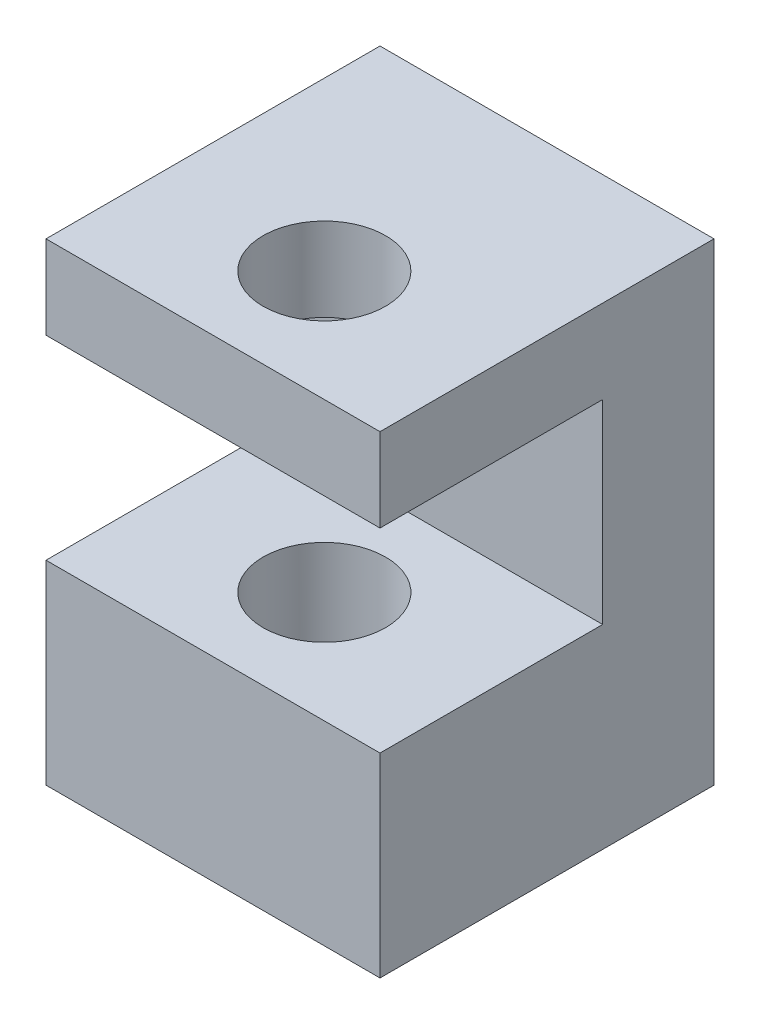
ISO-10303-21;
HEADER;
FILE_DESCRIPTION(('STEP AP214'),'2;1');
FILE_NAME('part.step','',(''),(''),'','','');
FILE_SCHEMA(('AUTOMOTIVE_DESIGN { 1 0 10303 214 1 1 1 1 }'));
ENDSEC;
DATA;
#1=APPLICATION_CONTEXT('core data for automotive mechanical design processes');
#2=APPLICATION_PROTOCOL_DEFINITION('international standard','automotive_design',2000,#1);
#3=PRODUCT_CONTEXT('',#1,'mechanical');
#4=PRODUCT('Part','Part','',(#3));
#5=PRODUCT_RELATED_PRODUCT_CATEGORY('part','',(#4));
#6=PRODUCT_DEFINITION_FORMATION('','',#4);
#7=PRODUCT_DEFINITION_CONTEXT('part definition',#1,'design');
#8=PRODUCT_DEFINITION('design','',#6,#7);
#9=PRODUCT_DEFINITION_SHAPE('','',#8);
#10=(LENGTH_UNIT() NAMED_UNIT(*) SI_UNIT(.MILLI.,.METRE.));
#11=(NAMED_UNIT(*) PLANE_ANGLE_UNIT() SI_UNIT($,.RADIAN.));
#12=(NAMED_UNIT(*) SI_UNIT($,.STERADIAN.) SOLID_ANGLE_UNIT());
#13=UNCERTAINTY_MEASURE_WITH_UNIT(LENGTH_MEASURE(1.E-05),#10,'distance_accuracy_value','');
#14=(GEOMETRIC_REPRESENTATION_CONTEXT(3) GLOBAL_UNCERTAINTY_ASSIGNED_CONTEXT((#13)) GLOBAL_UNIT_ASSIGNED_CONTEXT((#10,
#11,#12)) REPRESENTATION_CONTEXT('',''));
#15=CARTESIAN_POINT('',(0.,0.,0.));
#16=DIRECTION('',(0.,0.,1.));
#17=DIRECTION('',(1.,0.,0.));
#18=AXIS2_PLACEMENT_3D('',#15,#16,#17);
#19=CARTESIAN_POINT('',(0.,85.,0.));
#20=DIRECTION('',(0.,0.,-1.));
#21=DIRECTION('',(-1.,0.,0.));
#22=AXIS2_PLACEMENT_3D('',#19,#20,#21);
#23=PLANE('',#22);
#24=DIRECTION('',(0.,-1.,0.));
#25=VECTOR('',#24,1.);
#26=CARTESIAN_POINT('',(0.,85.,0.));
#27=LINE('',#26,#25);
#28=CARTESIAN_POINT('',(0.,85.,0.));
#29=VERTEX_POINT('',#28);
#30=CARTESIAN_POINT('',(0.,70.,0.));
#31=VERTEX_POINT('',#30);
#32=EDGE_CURVE('E11',#29,#31,#27,.T.);
#33=ORIENTED_EDGE('',*,*,#32,.T.);
#34=DIRECTION('',(1.,0.,0.));
#35=VECTOR('',#34,1.);
#36=CARTESIAN_POINT('',(0.,70.,0.));
#37=LINE('',#36,#35);
#38=CARTESIAN_POINT('',(60.,70.,0.));
#39=VERTEX_POINT('',#38);
#40=EDGE_CURVE('E160',#31,#39,#37,.T.);
#41=ORIENTED_EDGE('',*,*,#40,.T.);
#42=DIRECTION('',(0.,-1.,0.));
#43=VECTOR('',#42,1.);
#44=CARTESIAN_POINT('',(60.,85.,0.));
#45=LINE('',#44,#43);
#46=CARTESIAN_POINT('',(60.,85.,0.));
#47=VERTEX_POINT('',#46);
#48=EDGE_CURVE('E138',#47,#39,#45,.T.);
#49=ORIENTED_EDGE('',*,*,#48,.F.);
#50=DIRECTION('',(1.,0.,0.));
#51=VECTOR('',#50,1.);
#52=CARTESIAN_POINT('',(0.,85.,0.));
#53=LINE('',#52,#51);
#54=EDGE_CURVE('E93',#29,#47,#53,.T.);
#55=ORIENTED_EDGE('',*,*,#54,.F.);
#56=EDGE_LOOP('',(#33,#41,#49,#55));
#57=FACE_BOUND('',#56,.T.);
#58=ADVANCED_FACE('F39',(#57),#23,.F.);
#59=CARTESIAN_POINT('',(0.,85.,0.));
#60=DIRECTION('',(1.,0.,0.));
#61=DIRECTION('',(0.,0.,-1.));
#62=AXIS2_PLACEMENT_3D('',#59,#60,#61);
#63=PLANE('',#62);
#64=DIRECTION('',(0.,1.,0.));
#65=VECTOR('',#64,1.);
#66=CARTESIAN_POINT('',(0.,70.,-40.));
#67=LINE('',#66,#65);
#68=CARTESIAN_POINT('',(0.,35.,-40.));
#69=VERTEX_POINT('',#68);
#70=CARTESIAN_POINT('',(0.,70.,-40.));
#71=VERTEX_POINT('',#70);
#72=EDGE_CURVE('E122',#69,#71,#67,.T.);
#73=ORIENTED_EDGE('',*,*,#72,.T.);
#74=DIRECTION('',(0.,0.,1.));
#75=VECTOR('',#74,1.);
#76=CARTESIAN_POINT('',(0.,70.,0.));
#77=LINE('',#76,#75);
#78=EDGE_CURVE('E132',#71,#31,#77,.T.);
#79=ORIENTED_EDGE('',*,*,#78,.T.);
#80=ORIENTED_EDGE('',*,*,#32,.F.);
#81=DIRECTION('',(0.,0.,1.));
#82=VECTOR('',#81,1.);
#83=CARTESIAN_POINT('',(0.,85.,0.));
#84=LINE('',#83,#82);
#85=CARTESIAN_POINT('',(0.,85.,-60.));
#86=VERTEX_POINT('',#85);
#87=EDGE_CURVE('E151',#86,#29,#84,.T.);
#88=ORIENTED_EDGE('',*,*,#87,.F.);
#89=DIRECTION('',(0.,-1.,0.));
#90=VECTOR('',#89,1.);
#91=CARTESIAN_POINT('',(0.,85.,-60.));
#92=LINE('',#91,#90);
#93=CARTESIAN_POINT('',(0.,0.,-60.));
#94=VERTEX_POINT('',#93);
#95=EDGE_CURVE('E146',#86,#94,#92,.T.);
#96=ORIENTED_EDGE('',*,*,#95,.T.);
#97=DIRECTION('',(0.,0.,1.));
#98=VECTOR('',#97,1.);
#99=CARTESIAN_POINT('',(0.,0.,0.));
#100=LINE('',#99,#98);
#101=CARTESIAN_POINT('',(0.,0.,0.));
#102=VERTEX_POINT('',#101);
#103=EDGE_CURVE('E136',#94,#102,#100,.T.);
#104=ORIENTED_EDGE('',*,*,#103,.T.);
#105=CARTESIAN_POINT('',(0.,35.,0.));
#106=VERTEX_POINT('',#105);
#107=EDGE_CURVE('E49',#106,#102,#27,.T.);
#108=ORIENTED_EDGE('',*,*,#107,.F.);
#109=DIRECTION('',(0.,0.,-1.));
#110=VECTOR('',#109,1.);
#111=CARTESIAN_POINT('',(0.,35.,0.));
#112=LINE('',#111,#110);
#113=EDGE_CURVE('E114',#106,#69,#112,.T.);
#114=ORIENTED_EDGE('',*,*,#113,.T.);
#115=EDGE_LOOP('',(#73,#79,#80,#88,#96,#104,#108,#114));
#116=FACE_BOUND('',#115,.T.);
#117=ADVANCED_FACE('F41',(#116),#63,.F.);
#118=CARTESIAN_POINT('',(60.,35.,0.));
#119=VERTEX_POINT('',#118);
#120=CARTESIAN_POINT('',(60.,0.,0.));
#121=VERTEX_POINT('',#120);
#122=EDGE_CURVE('E130',#119,#121,#45,.T.);
#123=ORIENTED_EDGE('',*,*,#122,.F.);
#124=DIRECTION('',(1.,0.,0.));
#125=VECTOR('',#124,1.);
#126=CARTESIAN_POINT('',(0.,35.,0.));
#127=LINE('',#126,#125);
#128=EDGE_CURVE('E56',#106,#119,#127,.T.);
#129=ORIENTED_EDGE('',*,*,#128,.F.);
#130=ORIENTED_EDGE('',*,*,#107,.T.);
#131=DIRECTION('',(1.,0.,0.));
#132=VECTOR('',#131,1.);
#133=CARTESIAN_POINT('',(0.,0.,0.));
#134=LINE('',#133,#132);
#135=EDGE_CURVE('E155',#102,#121,#134,.T.);
#136=ORIENTED_EDGE('',*,*,#135,.T.);
#137=EDGE_LOOP('',(#123,#129,#130,#136));
#138=FACE_BOUND('',#137,.T.);
#139=ADVANCED_FACE('F127',(#138),#23,.F.);
#140=CARTESIAN_POINT('',(60.,85.,0.));
#141=DIRECTION('',(-1.,0.,0.));
#142=DIRECTION('',(0.,0.,1.));
#143=AXIS2_PLACEMENT_3D('',#140,#141,#142);
#144=PLANE('',#143);
#145=ORIENTED_EDGE('',*,*,#48,.T.);
#146=DIRECTION('',(0.,0.,1.));
#147=VECTOR('',#146,1.);
#148=CARTESIAN_POINT('',(60.,70.,0.));
#149=LINE('',#148,#147);
#150=CARTESIAN_POINT('',(60.,70.,-40.));
#151=VERTEX_POINT('',#150);
#152=EDGE_CURVE('E123',#151,#39,#149,.T.);
#153=ORIENTED_EDGE('',*,*,#152,.F.);
#154=DIRECTION('',(0.,1.,0.));
#155=VECTOR('',#154,1.);
#156=CARTESIAN_POINT('',(60.,70.,-40.));
#157=LINE('',#156,#155);
#158=CARTESIAN_POINT('',(60.,35.,-40.));
#159=VERTEX_POINT('',#158);
#160=EDGE_CURVE('E180',#159,#151,#157,.T.);
#161=ORIENTED_EDGE('',*,*,#160,.F.);
#162=DIRECTION('',(0.,0.,-1.));
#163=VECTOR('',#162,1.);
#164=CARTESIAN_POINT('',(60.,35.,0.));
#165=LINE('',#164,#163);
#166=EDGE_CURVE('E184',#119,#159,#165,.T.);
#167=ORIENTED_EDGE('',*,*,#166,.F.);
#168=ORIENTED_EDGE('',*,*,#122,.T.);
#169=DIRECTION('',(0.,0.,-1.));
#170=VECTOR('',#169,1.);
#171=CARTESIAN_POINT('',(60.,0.,0.));
#172=LINE('',#171,#170);
#173=CARTESIAN_POINT('',(60.,0.,-60.));
#174=VERTEX_POINT('',#173);
#175=EDGE_CURVE('E152',#121,#174,#172,.T.);
#176=ORIENTED_EDGE('',*,*,#175,.T.);
#177=DIRECTION('',(0.,-1.,0.));
#178=VECTOR('',#177,1.);
#179=CARTESIAN_POINT('',(60.,85.,-60.));
#180=LINE('',#179,#178);
#181=CARTESIAN_POINT('',(60.,85.,-60.));
#182=VERTEX_POINT('',#181);
#183=EDGE_CURVE('E143',#182,#174,#180,.T.);
#184=ORIENTED_EDGE('',*,*,#183,.F.);
#185=DIRECTION('',(0.,0.,-1.));
#186=VECTOR('',#185,1.);
#187=CARTESIAN_POINT('',(60.,85.,0.));
#188=LINE('',#187,#186);
#189=EDGE_CURVE('E163',#47,#182,#188,.T.);
#190=ORIENTED_EDGE('',*,*,#189,.F.);
#191=EDGE_LOOP('',(#145,#153,#161,#167,#168,#176,#184,#190));
#192=FACE_BOUND('',#191,.T.);
#193=ADVANCED_FACE('F220',(#192),#144,.F.);
#194=CARTESIAN_POINT('',(0.,85.,-60.));
#195=DIRECTION('',(0.,0.,1.));
#196=DIRECTION('',(1.,0.,0.));
#197=AXIS2_PLACEMENT_3D('',#194,#195,#196);
#198=PLANE('',#197);
#199=DIRECTION('',(-1.,0.,0.));
#200=VECTOR('',#199,1.);
#201=CARTESIAN_POINT('',(0.,0.,-60.));
#202=LINE('',#201,#200);
#203=EDGE_CURVE('E86',#174,#94,#202,.T.);
#204=ORIENTED_EDGE('',*,*,#203,.T.);
#205=ORIENTED_EDGE('',*,*,#95,.F.);
#206=DIRECTION('',(-1.,0.,0.));
#207=VECTOR('',#206,1.);
#208=CARTESIAN_POINT('',(0.,85.,-60.));
#209=LINE('',#208,#207);
#210=EDGE_CURVE('E65',#182,#86,#209,.T.);
#211=ORIENTED_EDGE('',*,*,#210,.F.);
#212=ORIENTED_EDGE('',*,*,#183,.T.);
#213=EDGE_LOOP('',(#204,#205,#211,#212));
#214=FACE_BOUND('',#213,.T.);
#215=ADVANCED_FACE('F211',(#214),#198,.F.);
#216=CARTESIAN_POINT('',(0.,85.,0.));
#217=DIRECTION('',(0.,-1.,0.));
#218=DIRECTION('',(0.,0.,-1.));
#219=AXIS2_PLACEMENT_3D('',#216,#217,#218);
#220=PLANE('',#219);
#221=CARTESIAN_POINT('',(30.,85.,-20.));
#222=DIRECTION('',(0.,1.,0.));
#223=DIRECTION('',(0.,0.,1.));
#224=AXIS2_PLACEMENT_3D('',#221,#222,#223);
#225=CIRCLE('',#224,11.);
#226=CARTESIAN_POINT('',(30.,85.,-9.));
#227=VERTEX_POINT('',#226);
#228=EDGE_CURVE('E200',#227,#227,#225,.T.);
#229=ORIENTED_EDGE('',*,*,#228,.F.);
#230=EDGE_LOOP('',(#229));
#231=FACE_BOUND('',#230,.T.);
#232=ORIENTED_EDGE('',*,*,#87,.T.);
#233=ORIENTED_EDGE('',*,*,#54,.T.);
#234=ORIENTED_EDGE('',*,*,#189,.T.);
#235=ORIENTED_EDGE('',*,*,#210,.T.);
#236=EDGE_LOOP('',(#232,#233,#234,#235));
#237=FACE_BOUND('',#236,.T.);
#238=ADVANCED_FACE('F208',(#231,#237),#220,.F.);
#239=CARTESIAN_POINT('',(0.,0.,0.));
#240=DIRECTION('',(0.,-1.,0.));
#241=DIRECTION('',(0.,0.,-1.));
#242=AXIS2_PLACEMENT_3D('',#239,#240,#241);
#243=PLANE('',#242);
#244=CARTESIAN_POINT('',(30.,0.,-20.));
#245=DIRECTION('',(0.,1.,0.));
#246=DIRECTION('',(0.,0.,1.));
#247=AXIS2_PLACEMENT_3D('',#244,#245,#246);
#248=CIRCLE('',#247,11.);
#249=CARTESIAN_POINT('',(30.,0.,-9.));
#250=VERTEX_POINT('',#249);
#251=EDGE_CURVE('E196',#250,#250,#248,.T.);
#252=ORIENTED_EDGE('',*,*,#251,.T.);
#253=EDGE_LOOP('',(#252));
#254=FACE_BOUND('',#253,.T.);
#255=ORIENTED_EDGE('',*,*,#103,.F.);
#256=ORIENTED_EDGE('',*,*,#203,.F.);
#257=ORIENTED_EDGE('',*,*,#175,.F.);
#258=ORIENTED_EDGE('',*,*,#135,.F.);
#259=EDGE_LOOP('',(#255,#256,#257,#258));
#260=FACE_BOUND('',#259,.T.);
#261=ADVANCED_FACE('F210',(#254,#260),#243,.T.);
#262=CARTESIAN_POINT('',(0.,70.,0.));
#263=DIRECTION('',(0.,1.,0.));
#264=DIRECTION('',(0.,0.,1.));
#265=AXIS2_PLACEMENT_3D('',#262,#263,#264);
#266=PLANE('',#265);
#267=CARTESIAN_POINT('',(30.,70.,-20.));
#268=DIRECTION('',(0.,1.,0.));
#269=DIRECTION('',(0.,0.,1.));
#270=AXIS2_PLACEMENT_3D('',#267,#268,#269);
#271=CIRCLE('',#270,11.);
#272=CARTESIAN_POINT('',(30.,70.,-9.));
#273=VERTEX_POINT('',#272);
#274=EDGE_CURVE('E187',#273,#273,#271,.T.);
#275=ORIENTED_EDGE('',*,*,#274,.T.);
#276=EDGE_LOOP('',(#275));
#277=FACE_BOUND('',#276,.T.);
#278=ORIENTED_EDGE('',*,*,#152,.T.);
#279=ORIENTED_EDGE('',*,*,#40,.F.);
#280=ORIENTED_EDGE('',*,*,#78,.F.);
#281=DIRECTION('',(1.,0.,0.));
#282=VECTOR('',#281,1.);
#283=CARTESIAN_POINT('',(0.,70.,-40.));
#284=LINE('',#283,#282);
#285=EDGE_CURVE('E172',#71,#151,#284,.T.);
#286=ORIENTED_EDGE('',*,*,#285,.T.);
#287=EDGE_LOOP('',(#278,#279,#280,#286));
#288=FACE_BOUND('',#287,.T.);
#289=ADVANCED_FACE('F226',(#277,#288),#266,.F.);
#290=CARTESIAN_POINT('',(0.,70.,-40.));
#291=DIRECTION('',(0.,0.,-1.));
#292=DIRECTION('',(-1.,0.,0.));
#293=AXIS2_PLACEMENT_3D('',#290,#291,#292);
#294=PLANE('',#293);
#295=ORIENTED_EDGE('',*,*,#160,.T.);
#296=ORIENTED_EDGE('',*,*,#285,.F.);
#297=ORIENTED_EDGE('',*,*,#72,.F.);
#298=DIRECTION('',(1.,0.,0.));
#299=VECTOR('',#298,1.);
#300=CARTESIAN_POINT('',(0.,35.,-40.));
#301=LINE('',#300,#299);
#302=EDGE_CURVE('E116',#69,#159,#301,.T.);
#303=ORIENTED_EDGE('',*,*,#302,.T.);
#304=EDGE_LOOP('',(#295,#296,#297,#303));
#305=FACE_BOUND('',#304,.T.);
#306=ADVANCED_FACE('F232',(#305),#294,.F.);
#307=CARTESIAN_POINT('',(0.,35.,0.));
#308=DIRECTION('',(0.,-1.,0.));
#309=DIRECTION('',(0.,0.,-1.));
#310=AXIS2_PLACEMENT_3D('',#307,#308,#309);
#311=PLANE('',#310);
#312=CARTESIAN_POINT('',(30.,35.,-20.));
#313=DIRECTION('',(0.,-1.,0.));
#314=DIRECTION('',(0.,0.,-1.));
#315=AXIS2_PLACEMENT_3D('',#312,#313,#314);
#316=CIRCLE('',#315,11.);
#317=CARTESIAN_POINT('',(30.,35.,-31.));
#318=VERTEX_POINT('',#317);
#319=EDGE_CURVE('E43',#318,#318,#316,.T.);
#320=ORIENTED_EDGE('',*,*,#319,.T.);
#321=EDGE_LOOP('',(#320));
#322=FACE_BOUND('',#321,.T.);
#323=ORIENTED_EDGE('',*,*,#166,.T.);
#324=ORIENTED_EDGE('',*,*,#302,.F.);
#325=ORIENTED_EDGE('',*,*,#113,.F.);
#326=ORIENTED_EDGE('',*,*,#128,.T.);
#327=EDGE_LOOP('',(#323,#324,#325,#326));
#328=FACE_BOUND('',#327,.T.);
#329=ADVANCED_FACE('F115',(#322,#328),#311,.F.);
#330=CARTESIAN_POINT('',(30.,0.,-20.));
#331=DIRECTION('',(0.,1.,0.));
#332=DIRECTION('',(0.,0.,1.));
#333=AXIS2_PLACEMENT_3D('',#330,#331,#332);
#334=CYLINDRICAL_SURFACE('',#333,11.);
#335=ORIENTED_EDGE('',*,*,#251,.F.);
#336=EDGE_LOOP('',(#335));
#337=FACE_BOUND('',#336,.T.);
#338=ORIENTED_EDGE('',*,*,#319,.F.);
#339=EDGE_LOOP('',(#338));
#340=FACE_BOUND('',#339,.T.);
#341=ADVANCED_FACE('F278',(#337,#340),#334,.F.);
#342=ORIENTED_EDGE('',*,*,#228,.T.);
#343=EDGE_LOOP('',(#342));
#344=FACE_BOUND('',#343,.T.);
#345=ORIENTED_EDGE('',*,*,#274,.F.);
#346=EDGE_LOOP('',(#345));
#347=FACE_BOUND('',#346,.T.);
#348=ADVANCED_FACE('F205',(#344,#347),#334,.F.);
#349=CLOSED_SHELL('',(#58,#117,#139,#193,#215,#238,#261,#289,#306,#329,#341,#348));
#350=MANIFOLD_SOLID_BREP('B2',#349);
#351=ADVANCED_BREP_SHAPE_REPRESENTATION('',(#18,#350),#14);
#352=SHAPE_DEFINITION_REPRESENTATION(#9,#351);
ENDSEC;
END-ISO-10303-21;
